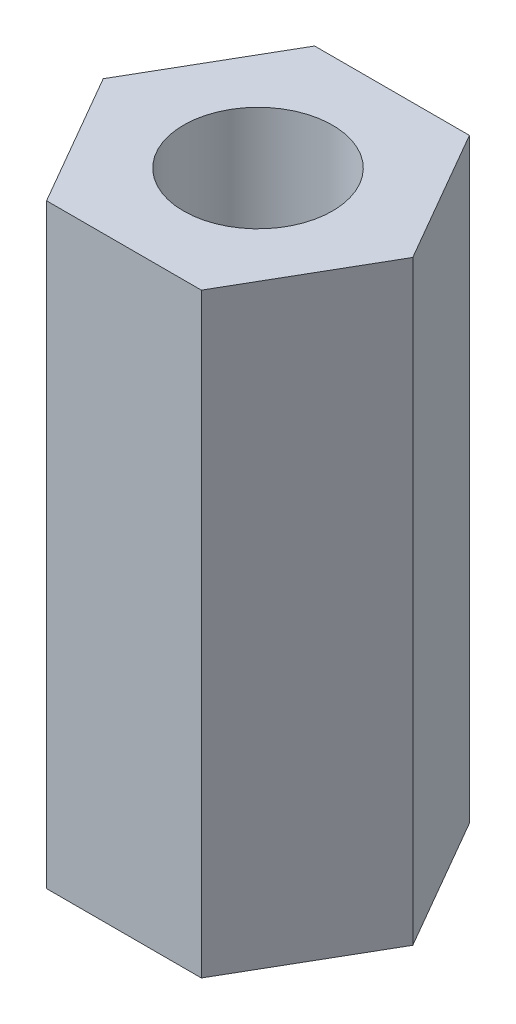
ISO-10303-21;
HEADER;
FILE_DESCRIPTION(('STEP AP214'),'2;1');
FILE_NAME('part.step','',(''),(''),'','','');
FILE_SCHEMA(('AUTOMOTIVE_DESIGN { 1 0 10303 214 1 1 1 1 }'));
ENDSEC;
DATA;
#1=APPLICATION_CONTEXT('core data for automotive mechanical design processes');
#2=APPLICATION_PROTOCOL_DEFINITION('international standard','automotive_design',2000,#1);
#3=PRODUCT_CONTEXT('',#1,'mechanical');
#4=PRODUCT('Part','Part','',(#3));
#5=PRODUCT_RELATED_PRODUCT_CATEGORY('part','',(#4));
#6=PRODUCT_DEFINITION_FORMATION('','',#4);
#7=PRODUCT_DEFINITION_CONTEXT('part definition',#1,'design');
#8=PRODUCT_DEFINITION('design','',#6,#7);
#9=PRODUCT_DEFINITION_SHAPE('','',#8);
#10=(LENGTH_UNIT() NAMED_UNIT(*) SI_UNIT(.MILLI.,.METRE.));
#11=(NAMED_UNIT(*) PLANE_ANGLE_UNIT() SI_UNIT($,.RADIAN.));
#12=(NAMED_UNIT(*) SI_UNIT($,.STERADIAN.) SOLID_ANGLE_UNIT());
#13=UNCERTAINTY_MEASURE_WITH_UNIT(LENGTH_MEASURE(1.E-05),#10,'distance_accuracy_value','');
#14=(GEOMETRIC_REPRESENTATION_CONTEXT(3) GLOBAL_UNCERTAINTY_ASSIGNED_CONTEXT((#13)) GLOBAL_UNIT_ASSIGNED_CONTEXT((#10,
#11,#12)) REPRESENTATION_CONTEXT('',''));
#15=CARTESIAN_POINT('',(0.,0.,0.));
#16=DIRECTION('',(0.,0.,1.));
#17=DIRECTION('',(1.,0.,0.));
#18=AXIS2_PLACEMENT_3D('',#15,#16,#17);
#19=CARTESIAN_POINT('',(0.,10.,0.));
#20=DIRECTION('',(0.,1.,0.));
#21=DIRECTION('',(0.,0.,1.));
#22=AXIS2_PLACEMENT_3D('',#19,#20,#21);
#23=PLANE('',#22);
#24=DIRECTION('',(1.,0.,0.));
#25=VECTOR('',#24,1.);
#26=CARTESIAN_POINT('',(-1.29903810567666,10.,2.25));
#27=LINE('',#26,#25);
#28=CARTESIAN_POINT('',(-1.29903810567666,10.,2.25));
#29=VERTEX_POINT('',#28);
#30=CARTESIAN_POINT('',(1.29903810567666,10.,2.25));
#31=VERTEX_POINT('',#30);
#32=EDGE_CURVE('E132',#29,#31,#27,.T.);
#33=ORIENTED_EDGE('',*,*,#32,.T.);
#34=DIRECTION('',(0.5,0.,-0.866025403784439));
#35=VECTOR('',#34,1.);
#36=CARTESIAN_POINT('',(1.29903810567666,10.,2.25));
#37=LINE('',#36,#35);
#38=CARTESIAN_POINT('',(2.59807621135332,10.,0.));
#39=VERTEX_POINT('',#38);
#40=EDGE_CURVE('E90',#31,#39,#37,.T.);
#41=ORIENTED_EDGE('',*,*,#40,.T.);
#42=DIRECTION('',(-0.5,0.,-0.866025403784439));
#43=VECTOR('',#42,1.);
#44=CARTESIAN_POINT('',(2.59807621135332,10.,0.));
#45=LINE('',#44,#43);
#46=CARTESIAN_POINT('',(1.29903810567666,10.,-2.25));
#47=VERTEX_POINT('',#46);
#48=EDGE_CURVE('E103',#39,#47,#45,.T.);
#49=ORIENTED_EDGE('',*,*,#48,.T.);
#50=DIRECTION('',(-1.,0.,0.));
#51=VECTOR('',#50,1.);
#52=CARTESIAN_POINT('',(1.29903810567666,10.,-2.25));
#53=LINE('',#52,#51);
#54=CARTESIAN_POINT('',(-1.29903810567666,10.,-2.25));
#55=VERTEX_POINT('',#54);
#56=EDGE_CURVE('E97',#47,#55,#53,.T.);
#57=ORIENTED_EDGE('',*,*,#56,.T.);
#58=DIRECTION('',(-0.5,0.,0.866025403784438));
#59=VECTOR('',#58,1.);
#60=CARTESIAN_POINT('',(-1.29903810567666,10.,-2.25));
#61=LINE('',#60,#59);
#62=CARTESIAN_POINT('',(-2.59807621135332,10.,0.));
#63=VERTEX_POINT('',#62);
#64=EDGE_CURVE('E101',#55,#63,#61,.T.);
#65=ORIENTED_EDGE('',*,*,#64,.T.);
#66=DIRECTION('',(0.5,0.,0.866025403784439));
#67=VECTOR('',#66,1.);
#68=CARTESIAN_POINT('',(-2.59807621135332,10.,0.));
#69=LINE('',#68,#67);
#70=EDGE_CURVE('E53',#63,#29,#69,.T.);
#71=ORIENTED_EDGE('',*,*,#70,.T.);
#72=EDGE_LOOP('',(#33,#41,#49,#57,#65,#71));
#73=FACE_BOUND('',#72,.T.);
#74=CARTESIAN_POINT('',(0.,10.,0.));
#75=DIRECTION('',(0.,1.,0.));
#76=DIRECTION('',(0.,0.,1.));
#77=AXIS2_PLACEMENT_3D('',#74,#75,#76);
#78=CIRCLE('',#77,1.25);
#79=CARTESIAN_POINT('',(0.,10.,1.25));
#80=VERTEX_POINT('',#79);
#81=EDGE_CURVE('E125',#80,#80,#78,.T.);
#82=ORIENTED_EDGE('',*,*,#81,.F.);
#83=EDGE_LOOP('',(#82));
#84=FACE_BOUND('',#83,.T.);
#85=ADVANCED_FACE('F36',(#73,#84),#23,.T.);
#86=CARTESIAN_POINT('',(0.,0.,0.));
#87=DIRECTION('',(0.,1.,0.));
#88=DIRECTION('',(0.,0.,1.));
#89=AXIS2_PLACEMENT_3D('',#86,#87,#88);
#90=PLANE('',#89);
#91=DIRECTION('',(1.,0.,0.));
#92=VECTOR('',#91,1.);
#93=CARTESIAN_POINT('',(-1.29903810567666,0.,2.25));
#94=LINE('',#93,#92);
#95=CARTESIAN_POINT('',(-1.29903810567666,0.,2.25));
#96=VERTEX_POINT('',#95);
#97=CARTESIAN_POINT('',(1.29903810567666,0.,2.25));
#98=VERTEX_POINT('',#97);
#99=EDGE_CURVE('E121',#96,#98,#94,.T.);
#100=ORIENTED_EDGE('',*,*,#99,.F.);
#101=DIRECTION('',(0.5,0.,0.866025403784439));
#102=VECTOR('',#101,1.);
#103=CARTESIAN_POINT('',(-2.59807621135332,0.,0.));
#104=LINE('',#103,#102);
#105=CARTESIAN_POINT('',(-2.59807621135332,0.,0.));
#106=VERTEX_POINT('',#105);
#107=EDGE_CURVE('E82',#106,#96,#104,.T.);
#108=ORIENTED_EDGE('',*,*,#107,.F.);
#109=DIRECTION('',(-0.5,0.,0.866025403784438));
#110=VECTOR('',#109,1.);
#111=CARTESIAN_POINT('',(-1.29903810567666,0.,-2.25));
#112=LINE('',#111,#110);
#113=CARTESIAN_POINT('',(-1.29903810567666,0.,-2.25));
#114=VERTEX_POINT('',#113);
#115=EDGE_CURVE('E76',#114,#106,#112,.T.);
#116=ORIENTED_EDGE('',*,*,#115,.F.);
#117=DIRECTION('',(-1.,0.,0.));
#118=VECTOR('',#117,1.);
#119=CARTESIAN_POINT('',(1.29903810567666,0.,-2.25));
#120=LINE('',#119,#118);
#121=CARTESIAN_POINT('',(1.29903810567666,0.,-2.25));
#122=VERTEX_POINT('',#121);
#123=EDGE_CURVE('E111',#122,#114,#120,.T.);
#124=ORIENTED_EDGE('',*,*,#123,.F.);
#125=DIRECTION('',(-0.5,0.,-0.866025403784439));
#126=VECTOR('',#125,1.);
#127=CARTESIAN_POINT('',(2.59807621135332,0.,0.));
#128=LINE('',#127,#126);
#129=CARTESIAN_POINT('',(2.59807621135332,0.,0.));
#130=VERTEX_POINT('',#129);
#131=EDGE_CURVE('E127',#130,#122,#128,.T.);
#132=ORIENTED_EDGE('',*,*,#131,.F.);
#133=DIRECTION('',(0.5,0.,-0.866025403784439));
#134=VECTOR('',#133,1.);
#135=CARTESIAN_POINT('',(1.29903810567666,0.,2.25));
#136=LINE('',#135,#134);
#137=EDGE_CURVE('E124',#98,#130,#136,.T.);
#138=ORIENTED_EDGE('',*,*,#137,.F.);
#139=EDGE_LOOP('',(#100,#108,#116,#124,#132,#138));
#140=FACE_BOUND('',#139,.T.);
#141=CARTESIAN_POINT('',(0.,0.,0.));
#142=DIRECTION('',(0.,1.,0.));
#143=DIRECTION('',(0.,0.,1.));
#144=AXIS2_PLACEMENT_3D('',#141,#142,#143);
#145=CIRCLE('',#144,1.25);
#146=CARTESIAN_POINT('',(0.,0.,1.25));
#147=VERTEX_POINT('',#146);
#148=EDGE_CURVE('E225',#147,#147,#145,.T.);
#149=ORIENTED_EDGE('',*,*,#148,.T.);
#150=EDGE_LOOP('',(#149));
#151=FACE_BOUND('',#150,.T.);
#152=ADVANCED_FACE('F141',(#140,#151),#90,.F.);
#153=CARTESIAN_POINT('',(-1.29903810567666,10.,2.25));
#154=DIRECTION('',(0.,0.,-1.));
#155=DIRECTION('',(-1.,0.,0.));
#156=AXIS2_PLACEMENT_3D('',#153,#154,#155);
#157=PLANE('',#156);
#158=ORIENTED_EDGE('',*,*,#99,.T.);
#159=DIRECTION('',(0.,-1.,0.));
#160=VECTOR('',#159,1.);
#161=CARTESIAN_POINT('',(1.29903810567666,10.,2.25));
#162=LINE('',#161,#160);
#163=EDGE_CURVE('E11',#31,#98,#162,.T.);
#164=ORIENTED_EDGE('',*,*,#163,.F.);
#165=ORIENTED_EDGE('',*,*,#32,.F.);
#166=DIRECTION('',(0.,-1.,0.));
#167=VECTOR('',#166,1.);
#168=CARTESIAN_POINT('',(-1.29903810567666,10.,2.25));
#169=LINE('',#168,#167);
#170=EDGE_CURVE('E117',#29,#96,#169,.T.);
#171=ORIENTED_EDGE('',*,*,#170,.T.);
#172=EDGE_LOOP('',(#158,#164,#165,#171));
#173=FACE_BOUND('',#172,.T.);
#174=ADVANCED_FACE('F38',(#173),#157,.F.);
#175=CARTESIAN_POINT('',(1.29903810567666,10.,2.25));
#176=DIRECTION('',(-0.866025403784439,0.,-0.5));
#177=DIRECTION('',(-0.5,0.,0.866025403784439));
#178=AXIS2_PLACEMENT_3D('',#175,#176,#177);
#179=PLANE('',#178);
#180=ORIENTED_EDGE('',*,*,#137,.T.);
#181=DIRECTION('',(0.,-1.,0.));
#182=VECTOR('',#181,1.);
#183=CARTESIAN_POINT('',(2.59807621135332,10.,0.));
#184=LINE('',#183,#182);
#185=EDGE_CURVE('E45',#39,#130,#184,.T.);
#186=ORIENTED_EDGE('',*,*,#185,.F.);
#187=ORIENTED_EDGE('',*,*,#40,.F.);
#188=ORIENTED_EDGE('',*,*,#163,.T.);
#189=EDGE_LOOP('',(#180,#186,#187,#188));
#190=FACE_BOUND('',#189,.T.);
#191=ADVANCED_FACE('F166',(#190),#179,.F.);
#192=CARTESIAN_POINT('',(2.59807621135332,10.,0.));
#193=DIRECTION('',(-0.866025403784439,0.,0.5));
#194=DIRECTION('',(0.5,0.,0.866025403784439));
#195=AXIS2_PLACEMENT_3D('',#192,#193,#194);
#196=PLANE('',#195);
#197=ORIENTED_EDGE('',*,*,#131,.T.);
#198=DIRECTION('',(0.,-1.,0.));
#199=VECTOR('',#198,1.);
#200=CARTESIAN_POINT('',(1.29903810567666,10.,-2.25));
#201=LINE('',#200,#199);
#202=EDGE_CURVE('E112',#47,#122,#201,.T.);
#203=ORIENTED_EDGE('',*,*,#202,.F.);
#204=ORIENTED_EDGE('',*,*,#48,.F.);
#205=ORIENTED_EDGE('',*,*,#185,.T.);
#206=EDGE_LOOP('',(#197,#203,#204,#205));
#207=FACE_BOUND('',#206,.T.);
#208=ADVANCED_FACE('F138',(#207),#196,.F.);
#209=CARTESIAN_POINT('',(1.29903810567666,10.,-2.25));
#210=DIRECTION('',(0.,0.,1.));
#211=DIRECTION('',(1.,0.,0.));
#212=AXIS2_PLACEMENT_3D('',#209,#210,#211);
#213=PLANE('',#212);
#214=ORIENTED_EDGE('',*,*,#123,.T.);
#215=DIRECTION('',(0.,-1.,0.));
#216=VECTOR('',#215,1.);
#217=CARTESIAN_POINT('',(-1.29903810567666,10.,-2.25));
#218=LINE('',#217,#216);
#219=EDGE_CURVE('E108',#55,#114,#218,.T.);
#220=ORIENTED_EDGE('',*,*,#219,.F.);
#221=ORIENTED_EDGE('',*,*,#56,.F.);
#222=ORIENTED_EDGE('',*,*,#202,.T.);
#223=EDGE_LOOP('',(#214,#220,#221,#222));
#224=FACE_BOUND('',#223,.T.);
#225=ADVANCED_FACE('F109',(#224),#213,.F.);
#226=CARTESIAN_POINT('',(-1.29903810567666,10.,-2.25));
#227=DIRECTION('',(0.866025403784438,0.,0.5));
#228=DIRECTION('',(0.5,0.,-0.866025403784439));
#229=AXIS2_PLACEMENT_3D('',#226,#227,#228);
#230=PLANE('',#229);
#231=ORIENTED_EDGE('',*,*,#115,.T.);
#232=DIRECTION('',(0.,-1.,0.));
#233=VECTOR('',#232,1.);
#234=CARTESIAN_POINT('',(-2.59807621135332,10.,0.));
#235=LINE('',#234,#233);
#236=EDGE_CURVE('E113',#63,#106,#235,.T.);
#237=ORIENTED_EDGE('',*,*,#236,.F.);
#238=ORIENTED_EDGE('',*,*,#64,.F.);
#239=ORIENTED_EDGE('',*,*,#219,.T.);
#240=EDGE_LOOP('',(#231,#237,#238,#239));
#241=FACE_BOUND('',#240,.T.);
#242=ADVANCED_FACE('F115',(#241),#230,.F.);
#243=CARTESIAN_POINT('',(-2.59807621135332,10.,0.));
#244=DIRECTION('',(0.866025403784439,0.,-0.5));
#245=DIRECTION('',(-0.5,0.,-0.866025403784439));
#246=AXIS2_PLACEMENT_3D('',#243,#244,#245);
#247=PLANE('',#246);
#248=ORIENTED_EDGE('',*,*,#107,.T.);
#249=ORIENTED_EDGE('',*,*,#170,.F.);
#250=ORIENTED_EDGE('',*,*,#70,.F.);
#251=ORIENTED_EDGE('',*,*,#236,.T.);
#252=EDGE_LOOP('',(#248,#249,#250,#251));
#253=FACE_BOUND('',#252,.T.);
#254=ADVANCED_FACE('F146',(#253),#247,.F.);
#255=CARTESIAN_POINT('',(0.,10.,0.));
#256=DIRECTION('',(0.,-1.,0.));
#257=DIRECTION('',(0.,0.,-1.));
#258=AXIS2_PLACEMENT_3D('',#255,#256,#257);
#259=CYLINDRICAL_SURFACE('',#258,1.25);
#260=ORIENTED_EDGE('',*,*,#81,.T.);
#261=EDGE_LOOP('',(#260));
#262=FACE_BOUND('',#261,.T.);
#263=ORIENTED_EDGE('',*,*,#148,.F.);
#264=EDGE_LOOP('',(#263));
#265=FACE_BOUND('',#264,.T.);
#266=ADVANCED_FACE('F148',(#262,#265),#259,.F.);
#267=CLOSED_SHELL('',(#85,#152,#174,#191,#208,#225,#242,#254,#266));
#268=MANIFOLD_SOLID_BREP('B2',#267);
#269=ADVANCED_BREP_SHAPE_REPRESENTATION('',(#18,#268),#14);
#270=SHAPE_DEFINITION_REPRESENTATION(#9,#269);
ENDSEC;
END-ISO-10303-21;
